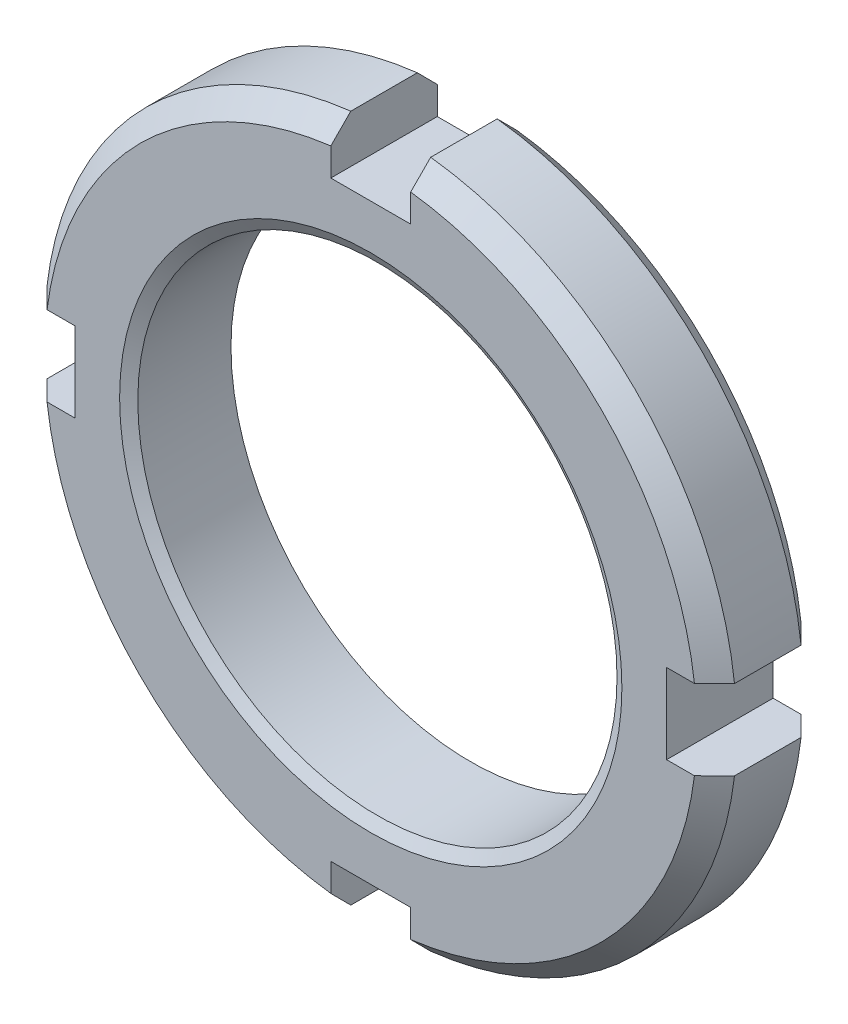
ISO-10303-21;
HEADER;
FILE_DESCRIPTION(('STEP AP214'),'2;1');
FILE_NAME('part.step','',(''),(''),'','','');
FILE_SCHEMA(('AUTOMOTIVE_DESIGN { 1 0 10303 214 1 1 1 1 }'));
ENDSEC;
DATA;
#1=APPLICATION_CONTEXT('core data for automotive mechanical design processes');
#2=APPLICATION_PROTOCOL_DEFINITION('international standard','automotive_design',2000,#1);
#3=PRODUCT_CONTEXT('',#1,'mechanical');
#4=PRODUCT('Part','Part','',(#3));
#5=PRODUCT_RELATED_PRODUCT_CATEGORY('part','',(#4));
#6=PRODUCT_DEFINITION_FORMATION('','',#4);
#7=PRODUCT_DEFINITION_CONTEXT('part definition',#1,'design');
#8=PRODUCT_DEFINITION('design','',#6,#7);
#9=PRODUCT_DEFINITION_SHAPE('','',#8);
#10=(LENGTH_UNIT() NAMED_UNIT(*) SI_UNIT(.MILLI.,.METRE.));
#11=(NAMED_UNIT(*) PLANE_ANGLE_UNIT() SI_UNIT($,.RADIAN.));
#12=(NAMED_UNIT(*) SI_UNIT($,.STERADIAN.) SOLID_ANGLE_UNIT());
#13=UNCERTAINTY_MEASURE_WITH_UNIT(LENGTH_MEASURE(1.E-05),#10,'distance_accuracy_value','');
#14=(GEOMETRIC_REPRESENTATION_CONTEXT(3) GLOBAL_UNCERTAINTY_ASSIGNED_CONTEXT((#13)) GLOBAL_UNIT_ASSIGNED_CONTEXT((#10,
#11,#12)) REPRESENTATION_CONTEXT('',''));
#15=CARTESIAN_POINT('',(0.,0.,0.));
#16=DIRECTION('',(0.,0.,1.));
#17=DIRECTION('',(1.,0.,0.));
#18=AXIS2_PLACEMENT_3D('',#15,#16,#17);
#19=CARTESIAN_POINT('',(0.,0.,8.));
#20=DIRECTION('',(0.,0.,-1.));
#21=DIRECTION('',(-1.,0.,0.));
#22=AXIS2_PLACEMENT_3D('',#19,#20,#21);
#23=CYLINDRICAL_SURFACE('',#22,26.);
#24=CARTESIAN_POINT('',(0.,0.,6.49999999999999));
#25=DIRECTION('',(0.,0.,1.));
#26=DIRECTION('',(1.,0.,0.));
#27=AXIS2_PLACEMENT_3D('',#24,#25,#26);
#28=CIRCLE('',#27,26.);
#29=CARTESIAN_POINT('',(3.00000000000018,25.8263431402899,6.49999999999999));
#30=VERTEX_POINT('',#29);
#31=CARTESIAN_POINT('',(25.8263431402899,2.99999999999973,6.49999999999999));
#32=VERTEX_POINT('',#31);
#33=EDGE_CURVE('E491',#30,#32,#28,.F.);
#34=ORIENTED_EDGE('',*,*,#33,.T.);
#35=DIRECTION('',(0.,0.,1.));
#36=VECTOR('',#35,1.);
#37=CARTESIAN_POINT('',(25.8263431402899,2.99999999999973,0.));
#38=LINE('',#37,#36);
#39=CARTESIAN_POINT('',(25.8263431402899,2.99999999999973,1.5));
#40=VERTEX_POINT('',#39);
#41=EDGE_CURVE('E233',#40,#32,#38,.T.);
#42=ORIENTED_EDGE('',*,*,#41,.F.);
#43=CARTESIAN_POINT('',(0.,0.,1.5));
#44=DIRECTION('',(0.,0.,1.));
#45=DIRECTION('',(1.,0.,0.));
#46=AXIS2_PLACEMENT_3D('',#43,#44,#45);
#47=CIRCLE('',#46,26.);
#48=CARTESIAN_POINT('',(3.00000000000018,25.8263431402899,1.5));
#49=VERTEX_POINT('',#48);
#50=EDGE_CURVE('E61',#40,#49,#47,.T.);
#51=ORIENTED_EDGE('',*,*,#50,.T.);
#52=DIRECTION('',(0.,0.,1.));
#53=VECTOR('',#52,1.);
#54=CARTESIAN_POINT('',(3.00000000000018,25.8263431402899,0.));
#55=LINE('',#54,#53);
#56=EDGE_CURVE('E560',#49,#30,#55,.T.);
#57=ORIENTED_EDGE('',*,*,#56,.T.);
#58=EDGE_LOOP('',(#34,#42,#51,#57));
#59=FACE_BOUND('',#58,.T.);
#60=ADVANCED_FACE('F38',(#59),#23,.T.);
#61=CARTESIAN_POINT('',(0.,0.,8.));
#62=DIRECTION('',(0.,0.,-1.));
#63=DIRECTION('',(-1.,0.,0.));
#64=AXIS2_PLACEMENT_3D('',#61,#62,#63);
#65=CONICAL_SURFACE('',#64,24.5,0.785398163397445);
#66=CARTESIAN_POINT('',(30.1313629364926,2.99999999999969,2.21965930821382));
#67=CARTESIAN_POINT('',(29.2073124987335,2.9999999999997,3.13914011143275));
#68=CARTESIAN_POINT('',(28.2830765827865,2.99999999999971,4.05843471087978));
#69=CARTESIAN_POINT('',(26.4340463341911,2.99999999999972,5.8964606902015));
#70=CARTESIAN_POINT('',(25.5092520019723,2.99999999999973,6.81519207050853));
#71=CARTESIAN_POINT('',(23.6589156087622,2.99999999999975,8.65190264222511));
#72=CARTESIAN_POINT('',(22.733373547422,2.99999999999976,9.56988183328331));
#73=CARTESIAN_POINT('',(21.3442551493303,2.99999999999978,10.9460384818329));
#74=CARTESIAN_POINT('',(20.8810812877656,2.99999999999978,11.4046221841258));
#75=CARTESIAN_POINT('',(19.9544022548731,2.99999999999979,12.3214548600768));
#76=CARTESIAN_POINT('',(19.4908970834902,2.9999999999998,12.779703833679));
#77=CARTESIAN_POINT('',(19.0271948382415,2.9999999999998,13.2377534173087));
#78=B_SPLINE_CURVE_WITH_KNOTS('',3,(#66,#67,#68,#69,#70,#71,#72,#73,#74,#75,#76,#77),
.UNSPECIFIED.,.F.,.F.,(4,2,2,2,2,4),(0.,3.91073251085395,7.8214620159967,11.7321933468449,
13.6875605126465,15.6429280046587),.UNSPECIFIED.);
#79=CARTESIAN_POINT('',(24.3156328315757,2.99999999999975,8.));
#80=VERTEX_POINT('',#79);
#81=EDGE_CURVE('E242',#32,#80,#78,.T.);
#82=ORIENTED_EDGE('',*,*,#81,.F.);
#83=ORIENTED_EDGE('',*,*,#33,.F.);
#84=CARTESIAN_POINT('',(3.00000000000013,19.0271948382414,13.2377534173087));
#85=CARTESIAN_POINT('',(3.00000000000013,19.4908970834901,12.779703833679));
#86=CARTESIAN_POINT('',(3.00000000000014,19.9544022548731,12.3214548600768));
#87=CARTESIAN_POINT('',(3.00000000000014,20.8810812877655,11.4046221841258));
#88=CARTESIAN_POINT('',(3.00000000000015,21.3442551493302,10.9460384818329));
#89=CARTESIAN_POINT('',(3.00000000000016,22.7333735474219,9.56988183328331));
#90=CARTESIAN_POINT('',(3.00000000000016,23.6589156087622,8.65190264222511));
#91=CARTESIAN_POINT('',(3.00000000000018,25.5092520019723,6.81519207050852));
#92=CARTESIAN_POINT('',(3.00000000000018,26.434046334191,5.8964606902015));
#93=CARTESIAN_POINT('',(3.00000000000019,28.2830765827864,4.05843471087978));
#94=CARTESIAN_POINT('',(3.0000000000002,29.2073124987334,3.13914011143275));
#95=CARTESIAN_POINT('',(3.00000000000021,30.1313629364926,2.21965930821382));
#96=B_SPLINE_CURVE_WITH_KNOTS('',3,(#84,#85,#86,#87,#88,#89,#90,#91,#92,#93,#94,#95),
.UNSPECIFIED.,.F.,.F.,(4,2,2,2,2,4),(0.,1.95536749201216,3.9107346578138,7.82146598866199,
11.7321954938047,15.6429280046587),.UNSPECIFIED.);
#97=CARTESIAN_POINT('',(3.00000000000017,24.3156328315756,8.));
#98=VERTEX_POINT('',#97);
#99=EDGE_CURVE('E334',#98,#30,#96,.T.);
#100=ORIENTED_EDGE('',*,*,#99,.F.);
#101=CARTESIAN_POINT('',(0.,0.,8.));
#102=DIRECTION('',(0.,0.,1.));
#103=DIRECTION('',(1.,0.,0.));
#104=AXIS2_PLACEMENT_3D('',#101,#102,#103);
#105=CIRCLE('',#104,24.5);
#106=EDGE_CURVE('E510',#80,#98,#105,.T.);
#107=ORIENTED_EDGE('',*,*,#106,.F.);
#108=EDGE_LOOP('',(#82,#83,#100,#107));
#109=FACE_BOUND('',#108,.T.);
#110=ADVANCED_FACE('F446',(#109),#65,.T.);
#111=CARTESIAN_POINT('',(0.,0.,1.5));
#112=DIRECTION('',(0.,0.,1.));
#113=DIRECTION('',(1.,0.,0.));
#114=AXIS2_PLACEMENT_3D('',#111,#112,#113);
#115=CONICAL_SURFACE('',#114,26.,0.785398163397449);
#116=CARTESIAN_POINT('',(19.0271948382415,2.9999999999998,-5.23775341730871));
#117=CARTESIAN_POINT('',(19.4908970834902,2.9999999999998,-4.77970383367899));
#118=CARTESIAN_POINT('',(19.9544022548731,2.99999999999979,-4.32145486007675));
#119=CARTESIAN_POINT('',(20.8810812877655,2.99999999999978,-3.40462218412577));
#120=CARTESIAN_POINT('',(21.3442551493303,2.99999999999978,-2.9460384818329));
#121=CARTESIAN_POINT('',(22.733373547422,2.99999999999976,-1.56988183328331));
#122=CARTESIAN_POINT('',(23.6589156087622,2.99999999999975,-0.651902642225105));
#123=CARTESIAN_POINT('',(25.5092520019723,2.99999999999973,1.18480792949147));
#124=CARTESIAN_POINT('',(26.4340463341911,2.99999999999972,2.10353930979849));
#125=CARTESIAN_POINT('',(28.2830765827865,2.99999999999971,3.9415652891202));
#126=CARTESIAN_POINT('',(29.2073124987335,2.9999999999997,4.86085988856722));
#127=CARTESIAN_POINT('',(30.1313629364926,2.99999999999969,5.78034069178615));
#128=B_SPLINE_CURVE_WITH_KNOTS('',3,(#116,#117,#118,#119,#120,#121,#122,#123,#124,#125,#126,
#127),.UNSPECIFIED.,.F.,.F.,(4,2,2,2,2,4),(0.,1.95536749201216,3.91073465781379,
7.82146598866199,11.7321954938047,15.6429280046587),.UNSPECIFIED.);
#129=CARTESIAN_POINT('',(24.3156328315757,2.99999999999975,0.));
#130=VERTEX_POINT('',#129);
#131=EDGE_CURVE('E266',#130,#40,#128,.T.);
#132=ORIENTED_EDGE('',*,*,#131,.F.);
#133=CARTESIAN_POINT('',(0.,0.,0.));
#134=DIRECTION('',(0.,0.,1.));
#135=DIRECTION('',(1.,0.,0.));
#136=AXIS2_PLACEMENT_3D('',#133,#134,#135);
#137=CIRCLE('',#136,24.5);
#138=CARTESIAN_POINT('',(3.00000000000017,24.3156328315756,0.));
#139=VERTEX_POINT('',#138);
#140=EDGE_CURVE('E415',#139,#130,#137,.F.);
#141=ORIENTED_EDGE('',*,*,#140,.F.);
#142=CARTESIAN_POINT('',(3.00000000000021,30.1313629364926,5.78034069178615));
#143=CARTESIAN_POINT('',(3.0000000000002,29.2073124987334,4.86085988856723));
#144=CARTESIAN_POINT('',(3.00000000000019,28.2830765827865,3.9415652891202));
#145=CARTESIAN_POINT('',(3.00000000000018,26.434046334191,2.10353930979849));
#146=CARTESIAN_POINT('',(3.00000000000018,25.5092520019723,1.18480792949147));
#147=CARTESIAN_POINT('',(3.00000000000016,23.6589156087622,-0.651902642225102));
#148=CARTESIAN_POINT('',(3.00000000000016,22.7333735474219,-1.5698818332833));
#149=CARTESIAN_POINT('',(3.00000000000015,21.3442551493302,-2.9460384818329));
#150=CARTESIAN_POINT('',(3.00000000000014,20.8810812877655,-3.40462218412577));
#151=CARTESIAN_POINT('',(3.00000000000014,19.9544022548731,-4.32145486007675));
#152=CARTESIAN_POINT('',(3.00000000000013,19.4908970834901,-4.77970383367899));
#153=CARTESIAN_POINT('',(3.00000000000013,19.0271948382414,-5.23775341730871));
#154=B_SPLINE_CURVE_WITH_KNOTS('',3,(#142,#143,#144,#145,#146,#147,#148,#149,#150,#151,#152,
#153),.UNSPECIFIED.,.F.,.F.,(4,2,2,2,2,4),(0.,3.91073251085395,7.82146201599669,
11.7321933468449,13.6875605126465,15.6429280046587),.UNSPECIFIED.);
#155=EDGE_CURVE('E319',#49,#139,#154,.T.);
#156=ORIENTED_EDGE('',*,*,#155,.F.);
#157=ORIENTED_EDGE('',*,*,#50,.F.);
#158=EDGE_LOOP('',(#132,#141,#156,#157));
#159=FACE_BOUND('',#158,.T.);
#160=ADVANCED_FACE('F281',(#159),#115,.T.);
#161=CARTESIAN_POINT('',(-25.8263431402899,3.00000000000009,6.49999999999999));
#162=VERTEX_POINT('',#161);
#163=CARTESIAN_POINT('',(-2.99999999999982,25.8263431402899,6.49999999999999));
#164=VERTEX_POINT('',#163);
#165=EDGE_CURVE('E488',#162,#164,#28,.F.);
#166=ORIENTED_EDGE('',*,*,#165,.T.);
#167=DIRECTION('',(0.,0.,1.));
#168=VECTOR('',#167,1.);
#169=CARTESIAN_POINT('',(-2.99999999999982,25.8263431402899,0.));
#170=LINE('',#169,#168);
#171=CARTESIAN_POINT('',(-2.99999999999982,25.8263431402899,1.5));
#172=VERTEX_POINT('',#171);
#173=EDGE_CURVE('E562',#172,#164,#170,.T.);
#174=ORIENTED_EDGE('',*,*,#173,.F.);
#175=CARTESIAN_POINT('',(-25.8263431402899,3.00000000000009,1.5));
#176=VERTEX_POINT('',#175);
#177=EDGE_CURVE('E499',#172,#176,#47,.T.);
#178=ORIENTED_EDGE('',*,*,#177,.T.);
#179=DIRECTION('',(0.,0.,1.));
#180=VECTOR('',#179,1.);
#181=CARTESIAN_POINT('',(-25.8263431402899,3.00000000000009,0.));
#182=LINE('',#181,#180);
#183=EDGE_CURVE('E372',#176,#162,#182,.T.);
#184=ORIENTED_EDGE('',*,*,#183,.T.);
#185=EDGE_LOOP('',(#166,#174,#178,#184));
#186=FACE_BOUND('',#185,.T.);
#187=ADVANCED_FACE('F447',(#186),#23,.T.);
#188=CARTESIAN_POINT('',(-2.99999999999979,30.1313629364926,2.21965930821382));
#189=CARTESIAN_POINT('',(-2.9999999999998,29.2073124987335,3.13914011143275));
#190=CARTESIAN_POINT('',(-2.9999999999998,28.2830765827865,4.05843471087978));
#191=CARTESIAN_POINT('',(-2.99999999999982,26.434046334191,5.8964606902015));
#192=CARTESIAN_POINT('',(-2.99999999999982,25.5092520019723,6.81519207050852));
#193=CARTESIAN_POINT('',(-2.99999999999984,23.6589156087622,8.65190264222511));
#194=CARTESIAN_POINT('',(-2.99999999999984,22.733373547422,9.56988183328331));
#195=CARTESIAN_POINT('',(-2.99999999999985,21.3442551493303,10.9460384818329));
#196=CARTESIAN_POINT('',(-2.99999999999986,20.8810812877655,11.4046221841258));
#197=CARTESIAN_POINT('',(-2.99999999999986,19.9544022548731,12.3214548600768));
#198=CARTESIAN_POINT('',(-2.99999999999987,19.4908970834902,12.779703833679));
#199=CARTESIAN_POINT('',(-2.99999999999987,19.0271948382415,13.2377534173087));
#200=B_SPLINE_CURVE_WITH_KNOTS('',3,(#188,#189,#190,#191,#192,#193,#194,#195,#196,#197,#198,
#199),.UNSPECIFIED.,.F.,.F.,(4,2,2,2,2,4),(0.,3.91073251085395,7.8214620159967,11.7321933468449,
13.6875605126465,15.6429280046587),.UNSPECIFIED.);
#201=CARTESIAN_POINT('',(-2.99999999999983,24.3156328315757,8.));
#202=VERTEX_POINT('',#201);
#203=EDGE_CURVE('E340',#164,#202,#200,.T.);
#204=ORIENTED_EDGE('',*,*,#203,.F.);
#205=ORIENTED_EDGE('',*,*,#165,.F.);
#206=CARTESIAN_POINT('',(-19.8573214043135,3.00000000000007,12.4173404810467));
#207=CARTESIAN_POINT('',(-20.7842447544094,3.00000000000007,11.5007548146203));
#208=CARTESIAN_POINT('',(-21.7105177050019,3.00000000000007,10.5835122115696));
#209=CARTESIAN_POINT('',(-23.5620767121408,3.00000000000008,8.74803253484022));
#210=CARTESIAN_POINT('',(-24.4873627693173,3.00000000000008,7.8297954617972));
#211=CARTESIAN_POINT('',(-26.3372627372447,3.00000000000009,5.99264541428472));
#212=CARTESIAN_POINT('',(-27.2618766482431,3.00000000000009,5.07373244006441));
#213=CARTESIAN_POINT('',(-29.1105936921881,3.0000000000001,3.23539164256677));
#214=CARTESIAN_POINT('',(-30.0346968248145,3.0000000000001,2.31596381896732));
#215=CARTESIAN_POINT('',(-30.9586245027919,3.0000000000001,1.39635984157373));
#216=B_SPLINE_CURVE_WITH_KNOTS('',3,(#206,#207,#208,#209,#210,#211,#212,#213,#214,#215),
.UNSPECIFIED.,.F.,.F.,(4,2,2,2,4),(0.,3.91073354108376,7.82146458395427,11.7321941859439,
15.6429262375267),.UNSPECIFIED.);
#217=CARTESIAN_POINT('',(-24.3156328315756,3.00000000000008,8.));
#218=VERTEX_POINT('',#217);
#219=EDGE_CURVE('E369',#218,#162,#216,.T.);
#220=ORIENTED_EDGE('',*,*,#219,.F.);
#221=EDGE_CURVE('E515',#202,#218,#105,.T.);
#222=ORIENTED_EDGE('',*,*,#221,.F.);
#223=EDGE_LOOP('',(#204,#205,#220,#222));
#224=FACE_BOUND('',#223,.T.);
#225=ADVANCED_FACE('F453',(#224),#65,.T.);
#226=CARTESIAN_POINT('',(-2.99999999999987,19.0271948382415,-5.23775341730871));
#227=CARTESIAN_POINT('',(-2.99999999999987,19.4908970834902,-4.77970383367899));
#228=CARTESIAN_POINT('',(-2.99999999999986,19.9544022548731,-4.32145486007675));
#229=CARTESIAN_POINT('',(-2.99999999999986,20.8810812877655,-3.40462218412577));
#230=CARTESIAN_POINT('',(-2.99999999999985,21.3442551493303,-2.9460384818329));
#231=CARTESIAN_POINT('',(-2.99999999999984,22.733373547422,-1.5698818332833));
#232=CARTESIAN_POINT('',(-2.99999999999984,23.6589156087622,-0.6519026422251));
#233=CARTESIAN_POINT('',(-2.99999999999982,25.5092520019723,1.18480792949148));
#234=CARTESIAN_POINT('',(-2.99999999999982,26.4340463341911,2.10353930979849));
#235=CARTESIAN_POINT('',(-2.9999999999998,28.2830765827865,3.9415652891202));
#236=CARTESIAN_POINT('',(-2.9999999999998,29.2073124987335,4.86085988856723));
#237=CARTESIAN_POINT('',(-2.99999999999979,30.1313629364926,5.78034069178615));
#238=B_SPLINE_CURVE_WITH_KNOTS('',3,(#226,#227,#228,#229,#230,#231,#232,#233,#234,#235,#236,
#237),.UNSPECIFIED.,.F.,.F.,(4,2,2,2,2,4),(0.,1.95536749201215,3.91073465781379,
7.82146598866199,11.7321954938047,15.6429280046587),.UNSPECIFIED.);
#239=CARTESIAN_POINT('',(-2.99999999999983,24.3156328315757,0.));
#240=VERTEX_POINT('',#239);
#241=EDGE_CURVE('E267',#240,#172,#238,.T.);
#242=ORIENTED_EDGE('',*,*,#241,.F.);
#243=CARTESIAN_POINT('',(-24.3156328315756,3.00000000000008,0.));
#244=VERTEX_POINT('',#243);
#245=EDGE_CURVE('E411',#244,#240,#137,.F.);
#246=ORIENTED_EDGE('',*,*,#245,.F.);
#247=CARTESIAN_POINT('',(-30.5840452030114,3.0000000000001,6.23082851111965));
#248=CARTESIAN_POINT('',(-29.660064270092,3.0000000000001,5.3112779535301));
#249=CARTESIAN_POINT('',(-28.735901833792,3.0000000000001,4.3919096373639));
#250=CARTESIAN_POINT('',(-26.8870453113016,3.00000000000009,2.55370903917691));
#251=CARTESIAN_POINT('',(-25.9623512254766,3.00000000000009,1.63487675678853));
#252=CARTESIAN_POINT('',(-24.1122611135231,3.00000000000008,-0.202081861988787));
#253=CARTESIAN_POINT('',(-23.1868650871071,3.00000000000008,-1.12020819808834));
#254=CARTESIAN_POINT('',(-21.3350354411678,3.00000000000007,-2.95541504899515));
#255=CARTESIAN_POINT('',(-20.4086018209177,3.00000000000007,-3.87249556306902));
#256=CARTESIAN_POINT('',(-19.4814820363252,3.00000000000007,-4.78888277312363));
#257=B_SPLINE_CURVE_WITH_KNOTS('',3,(#247,#248,#249,#250,#251,#252,#253,#254,#255,#256),
.UNSPECIFIED.,.F.,.F.,(4,2,2,2,4),(0.,3.91073224651511,7.82146180805566,11.7321929718676,
15.6429268764249),.UNSPECIFIED.);
#258=EDGE_CURVE('E305',#176,#244,#257,.T.);
#259=ORIENTED_EDGE('',*,*,#258,.F.);
#260=ORIENTED_EDGE('',*,*,#177,.F.);
#261=EDGE_LOOP('',(#242,#246,#259,#260));
#262=FACE_BOUND('',#261,.T.);
#263=ADVANCED_FACE('F470',(#262),#115,.T.);
#264=CARTESIAN_POINT('',(-3.,-25.8263431402899,6.49999999999999));
#265=VERTEX_POINT('',#264);
#266=CARTESIAN_POINT('',(-25.8263431402899,-2.99999999999991,6.49999999999999));
#267=VERTEX_POINT('',#266);
#268=EDGE_CURVE('E482',#265,#267,#28,.F.);
#269=ORIENTED_EDGE('',*,*,#268,.T.);
#270=DIRECTION('',(0.,0.,1.));
#271=VECTOR('',#270,1.);
#272=CARTESIAN_POINT('',(-25.8263431402899,-2.99999999999991,0.));
#273=LINE('',#272,#271);
#274=CARTESIAN_POINT('',(-25.8263431402899,-2.99999999999991,1.5));
#275=VERTEX_POINT('',#274);
#276=EDGE_CURVE('E370',#275,#267,#273,.T.);
#277=ORIENTED_EDGE('',*,*,#276,.F.);
#278=CARTESIAN_POINT('',(-3.,-25.8263431402899,1.5));
#279=VERTEX_POINT('',#278);
#280=EDGE_CURVE('E497',#275,#279,#47,.T.);
#281=ORIENTED_EDGE('',*,*,#280,.T.);
#282=DIRECTION('',(0.,0.,1.));
#283=VECTOR('',#282,1.);
#284=CARTESIAN_POINT('',(-3.,-25.8263431402899,0.));
#285=LINE('',#284,#283);
#286=EDGE_CURVE('E485',#279,#265,#285,.T.);
#287=ORIENTED_EDGE('',*,*,#286,.T.);
#288=EDGE_LOOP('',(#269,#277,#281,#287));
#289=FACE_BOUND('',#288,.T.);
#290=ADVANCED_FACE('F458',(#289),#23,.T.);
#291=CARTESIAN_POINT('',(-30.9586245027919,-2.99999999999989,1.39635984157373));
#292=CARTESIAN_POINT('',(-30.0346968248145,-2.9999999999999,2.31596381896732));
#293=CARTESIAN_POINT('',(-29.1105936921881,-2.9999999999999,3.23539164256678));
#294=CARTESIAN_POINT('',(-27.2618766482431,-2.99999999999991,5.07373244006441));
#295=CARTESIAN_POINT('',(-26.3372627372447,-2.99999999999991,5.99264541428472));
#296=CARTESIAN_POINT('',(-24.4873627693173,-2.99999999999992,7.82979546179721));
#297=CARTESIAN_POINT('',(-23.5620767121408,-2.99999999999992,8.74803253484023));
#298=CARTESIAN_POINT('',(-21.7105177050019,-2.99999999999993,10.5835122115696));
#299=CARTESIAN_POINT('',(-20.7842447544094,-2.99999999999993,11.5007548146203));
#300=CARTESIAN_POINT('',(-19.8573214043135,-2.99999999999993,12.4173404810467));
#301=B_SPLINE_CURVE_WITH_KNOTS('',3,(#291,#292,#293,#294,#295,#296,#297,#298,#299,#300),
.UNSPECIFIED.,.F.,.F.,(4,2,2,2,4),(0.,3.91073205158287,7.82146165357248,11.732192696443,
15.6429262375267),.UNSPECIFIED.);
#302=CARTESIAN_POINT('',(-24.3156328315757,-2.99999999999992,8.));
#303=VERTEX_POINT('',#302);
#304=EDGE_CURVE('E380',#267,#303,#301,.T.);
#305=ORIENTED_EDGE('',*,*,#304,.F.);
#306=ORIENTED_EDGE('',*,*,#268,.F.);
#307=CARTESIAN_POINT('',(-3.,-24.3156328315757,8.));
#308=CARTESIAN_POINT('',(-3.,-24.5674710923891,7.75005358911742));
#309=CARTESIAN_POINT('',(-3.,-24.8192827485643,7.50008038363407));
#310=CARTESIAN_POINT('',(-3.,-25.322852851469,7.00008038363402));
#311=CARTESIAN_POINT('',(-3.,-25.5746112981985,6.75005358911737));
#312=CARTESIAN_POINT('',(-3.,-25.8263431402899,6.49999999999999));
#313=B_SPLINE_CURVE_WITH_KNOTS('',3,(#307,#308,#309,#310,#311,#312),.UNSPECIFIED.,.F.,.F.,(4,2,
4),(0.,1.06445357945192,2.1289071581877),.UNSPECIFIED.);
#314=CARTESIAN_POINT('',(-3.,-24.3156328315757,8.));
#315=VERTEX_POINT('',#314);
#316=EDGE_CURVE('E500',#315,#265,#313,.T.);
#317=ORIENTED_EDGE('',*,*,#316,.F.);
#318=EDGE_CURVE('E511',#303,#315,#105,.T.);
#319=ORIENTED_EDGE('',*,*,#318,.F.);
#320=EDGE_LOOP('',(#305,#306,#317,#319));
#321=FACE_BOUND('',#320,.T.);
#322=ADVANCED_FACE('F469',(#321),#65,.T.);
#323=CARTESIAN_POINT('',(-19.4814820363252,-2.99999999999993,-4.78888277312363));
#324=CARTESIAN_POINT('',(-20.4086018209178,-2.99999999999993,-3.87249556306902));
#325=CARTESIAN_POINT('',(-21.3350354411678,-2.99999999999993,-2.95541504899515));
#326=CARTESIAN_POINT('',(-23.1868650871071,-2.99999999999992,-1.12020819808834));
#327=CARTESIAN_POINT('',(-24.1122611135231,-2.99999999999992,-0.202081861988786));
#328=CARTESIAN_POINT('',(-25.9623512254766,-2.99999999999991,1.63487675678853));
#329=CARTESIAN_POINT('',(-26.8870453113016,-2.99999999999991,2.55370903917691));
#330=CARTESIAN_POINT('',(-28.735901833792,-2.9999999999999,4.3919096373639));
#331=CARTESIAN_POINT('',(-29.660064270092,-2.9999999999999,5.3112779535301));
#332=CARTESIAN_POINT('',(-30.5840452030114,-2.99999999999989,6.23082851111965));
#333=B_SPLINE_CURVE_WITH_KNOTS('',3,(#323,#324,#325,#326,#327,#328,#329,#330,#331,#332),
.UNSPECIFIED.,.F.,.F.,(4,2,2,2,4),(0.,3.9107339045573,7.82146506836919,11.7321946299097,
15.6429268764249),.UNSPECIFIED.);
#334=CARTESIAN_POINT('',(-24.3156328315757,-2.99999999999992,0.));
#335=VERTEX_POINT('',#334);
#336=EDGE_CURVE('E313',#335,#275,#333,.T.);
#337=ORIENTED_EDGE('',*,*,#336,.F.);
#338=CARTESIAN_POINT('',(-3.,-24.3156328315757,0.));
#339=VERTEX_POINT('',#338);
#340=EDGE_CURVE('E409',#339,#335,#137,.F.);
#341=ORIENTED_EDGE('',*,*,#340,.F.);
#342=CARTESIAN_POINT('',(-3.,-25.8263431402899,1.5));
#343=CARTESIAN_POINT('',(-3.,-25.5746112981985,1.24994641088262));
#344=CARTESIAN_POINT('',(-3.,-25.322852851469,0.999919616365968));
#345=CARTESIAN_POINT('',(-3.,-24.8192827485643,0.499919616365931));
#346=CARTESIAN_POINT('',(-3.,-24.5674710923891,0.249946410882583));
#347=CARTESIAN_POINT('',(-3.,-24.3156328315757,0.));
#348=B_SPLINE_CURVE_WITH_KNOTS('',3,(#342,#343,#344,#345,#346,#347),.UNSPECIFIED.,.F.,.F.,(4,2,
4),(0.,1.06445357873578,2.1289071581877),.UNSPECIFIED.);
#349=EDGE_CURVE('E286',#279,#339,#348,.T.);
#350=ORIENTED_EDGE('',*,*,#349,.F.);
#351=ORIENTED_EDGE('',*,*,#280,.F.);
#352=EDGE_LOOP('',(#337,#341,#350,#351));
#353=FACE_BOUND('',#352,.T.);
#354=ADVANCED_FACE('F282',(#353),#115,.T.);
#355=CARTESIAN_POINT('',(0.,0.,8.));
#356=DIRECTION('',(0.,0.,1.));
#357=DIRECTION('',(1.,0.,0.));
#358=AXIS2_PLACEMENT_3D('',#355,#356,#357);
#359=PLANE('',#358);
#360=CARTESIAN_POINT('',(0.,0.,8.));
#361=DIRECTION('',(0.,0.,1.));
#362=DIRECTION('',(1.,0.,0.));
#363=AXIS2_PLACEMENT_3D('',#360,#361,#362);
#364=CIRCLE('',#363,18.866);
#365=CARTESIAN_POINT('',(18.866,0.,8.));
#366=VERTEX_POINT('',#365);
#367=EDGE_CURVE('E11',#366,#366,#364,.F.);
#368=ORIENTED_EDGE('',*,*,#367,.T.);
#369=EDGE_LOOP('',(#368));
#370=FACE_BOUND('',#369,.T.);
#371=DIRECTION('',(-1.,0.,0.));
#372=VECTOR('',#371,1.);
#373=CARTESIAN_POINT('',(22.22634314029,2.99999999999977,8.));
#374=LINE('',#373,#372);
#375=CARTESIAN_POINT('',(22.22634314029,2.99999999999977,8.));
#376=VERTEX_POINT('',#375);
#377=EDGE_CURVE('E222',#80,#376,#374,.T.);
#378=ORIENTED_EDGE('',*,*,#377,.F.);
#379=ORIENTED_EDGE('',*,*,#106,.T.);
#380=DIRECTION('',(0.,1.,0.));
#381=VECTOR('',#380,1.);
#382=CARTESIAN_POINT('',(3.00000000000015,22.2263431402899,8.));
#383=LINE('',#382,#381);
#384=CARTESIAN_POINT('',(3.00000000000015,22.2263431402899,8.));
#385=VERTEX_POINT('',#384);
#386=EDGE_CURVE('E561',#385,#98,#383,.T.);
#387=ORIENTED_EDGE('',*,*,#386,.F.);
#388=DIRECTION('',(1.,0.,0.));
#389=VECTOR('',#388,1.);
#390=CARTESIAN_POINT('',(3.00000000000015,22.2263431402899,8.));
#391=LINE('',#390,#389);
#392=CARTESIAN_POINT('',(-2.99999999999985,22.2263431402899,8.));
#393=VERTEX_POINT('',#392);
#394=EDGE_CURVE('E572',#393,#385,#391,.T.);
#395=ORIENTED_EDGE('',*,*,#394,.F.);
#396=DIRECTION('',(0.,-1.,0.));
#397=VECTOR('',#396,1.);
#398=CARTESIAN_POINT('',(-2.99999999999985,22.2263431402899,8.));
#399=LINE('',#398,#397);
#400=EDGE_CURVE('E568',#202,#393,#399,.T.);
#401=ORIENTED_EDGE('',*,*,#400,.F.);
#402=ORIENTED_EDGE('',*,*,#221,.T.);
#403=DIRECTION('',(-1.,0.,0.));
#404=VECTOR('',#403,1.);
#405=CARTESIAN_POINT('',(-22.2263431402899,3.00000000000008,8.));
#406=LINE('',#405,#404);
#407=CARTESIAN_POINT('',(-22.2263431402899,3.00000000000008,8.));
#408=VERTEX_POINT('',#407);
#409=EDGE_CURVE('E362',#408,#218,#406,.T.);
#410=ORIENTED_EDGE('',*,*,#409,.F.);
#411=DIRECTION('',(0.,1.,0.));
#412=VECTOR('',#411,1.);
#413=CARTESIAN_POINT('',(-22.2263431402899,3.00000000000008,8.));
#414=LINE('',#413,#412);
#415=CARTESIAN_POINT('',(-22.2263431402899,-2.99999999999992,8.));
#416=VERTEX_POINT('',#415);
#417=EDGE_CURVE('E348',#416,#408,#414,.T.);
#418=ORIENTED_EDGE('',*,*,#417,.F.);
#419=DIRECTION('',(1.,0.,0.));
#420=VECTOR('',#419,1.);
#421=CARTESIAN_POINT('',(-22.2263431402899,-2.99999999999992,8.));
#422=LINE('',#421,#420);
#423=EDGE_CURVE('E353',#303,#416,#422,.T.);
#424=ORIENTED_EDGE('',*,*,#423,.F.);
#425=ORIENTED_EDGE('',*,*,#318,.T.);
#426=DIRECTION('',(0.,-1.,0.));
#427=VECTOR('',#426,1.);
#428=CARTESIAN_POINT('',(-3.,-22.2263431402899,8.));
#429=LINE('',#428,#427);
#430=CARTESIAN_POINT('',(-3.,-22.2263431402899,8.));
#431=VERTEX_POINT('',#430);
#432=EDGE_CURVE('E543',#431,#315,#429,.T.);
#433=ORIENTED_EDGE('',*,*,#432,.F.);
#434=DIRECTION('',(-1.,0.,0.));
#435=VECTOR('',#434,1.);
#436=CARTESIAN_POINT('',(-3.,-22.2263431402899,8.));
#437=LINE('',#436,#435);
#438=CARTESIAN_POINT('',(3.,-22.2263431402899,8.));
#439=VERTEX_POINT('',#438);
#440=EDGE_CURVE('E542',#439,#431,#437,.T.);
#441=ORIENTED_EDGE('',*,*,#440,.F.);
#442=DIRECTION('',(0.,1.,0.));
#443=VECTOR('',#442,1.);
#444=CARTESIAN_POINT('',(3.,-22.2263431402899,8.));
#445=LINE('',#444,#443);
#446=CARTESIAN_POINT('',(3.,-24.3156328315757,8.));
#447=VERTEX_POINT('',#446);
#448=EDGE_CURVE('E531',#447,#439,#445,.T.);
#449=ORIENTED_EDGE('',*,*,#448,.F.);
#450=CARTESIAN_POINT('',(24.3156328315756,-3.00000000000025,8.));
#451=VERTEX_POINT('',#450);
#452=EDGE_CURVE('E504',#447,#451,#105,.T.);
#453=ORIENTED_EDGE('',*,*,#452,.T.);
#454=DIRECTION('',(1.,0.,0.));
#455=VECTOR('',#454,1.);
#456=CARTESIAN_POINT('',(22.2263431402899,-3.00000000000023,8.));
#457=LINE('',#456,#455);
#458=CARTESIAN_POINT('',(22.2263431402899,-3.00000000000023,8.));
#459=VERTEX_POINT('',#458);
#460=EDGE_CURVE('E224',#459,#451,#457,.T.);
#461=ORIENTED_EDGE('',*,*,#460,.F.);
#462=DIRECTION('',(0.,-1.,0.));
#463=VECTOR('',#462,1.);
#464=CARTESIAN_POINT('',(22.2263431402899,-3.00000000000023,8.));
#465=LINE('',#464,#463);
#466=EDGE_CURVE('E209',#376,#459,#465,.T.);
#467=ORIENTED_EDGE('',*,*,#466,.F.);
#468=EDGE_LOOP('',(#378,#379,#387,#395,#401,#402,#410,#418,#424,#425,#433,#441,#449,#453,#461,#467));
#469=FACE_BOUND('',#468,.T.);
#470=ADVANCED_FACE('F466',(#370,#469),#359,.T.);
#471=CARTESIAN_POINT('',(0.,0.,0.));
#472=DIRECTION('',(0.,0.,1.));
#473=DIRECTION('',(1.,0.,0.));
#474=AXIS2_PLACEMENT_3D('',#471,#472,#473);
#475=PLANE('',#474);
#476=CARTESIAN_POINT('',(0.,0.,0.));
#477=DIRECTION('',(0.,0.,1.));
#478=DIRECTION('',(1.,0.,0.));
#479=AXIS2_PLACEMENT_3D('',#476,#477,#478);
#480=CIRCLE('',#479,18.866);
#481=CARTESIAN_POINT('',(18.866,0.,0.));
#482=VERTEX_POINT('',#481);
#483=EDGE_CURVE('E426',#482,#482,#480,.T.);
#484=ORIENTED_EDGE('',*,*,#483,.T.);
#485=EDGE_LOOP('',(#484));
#486=FACE_BOUND('',#485,.T.);
#487=ORIENTED_EDGE('',*,*,#140,.T.);
#488=DIRECTION('',(-1.,0.,0.));
#489=VECTOR('',#488,1.);
#490=CARTESIAN_POINT('',(22.22634314029,2.99999999999977,0.));
#491=LINE('',#490,#489);
#492=CARTESIAN_POINT('',(22.22634314029,2.99999999999977,0.));
#493=VERTEX_POINT('',#492);
#494=EDGE_CURVE('E211',#130,#493,#491,.T.);
#495=ORIENTED_EDGE('',*,*,#494,.T.);
#496=DIRECTION('',(0.,-1.,0.));
#497=VECTOR('',#496,1.);
#498=CARTESIAN_POINT('',(22.2263431402899,-3.00000000000023,0.));
#499=LINE('',#498,#497);
#500=CARTESIAN_POINT('',(22.2263431402899,-3.00000000000023,0.));
#501=VERTEX_POINT('',#500);
#502=EDGE_CURVE('E206',#493,#501,#499,.T.);
#503=ORIENTED_EDGE('',*,*,#502,.T.);
#504=DIRECTION('',(1.,0.,0.));
#505=VECTOR('',#504,1.);
#506=CARTESIAN_POINT('',(22.2263431402899,-3.00000000000023,0.));
#507=LINE('',#506,#505);
#508=CARTESIAN_POINT('',(24.3156328315756,-3.00000000000025,0.));
#509=VERTEX_POINT('',#508);
#510=EDGE_CURVE('E214',#501,#509,#507,.T.);
#511=ORIENTED_EDGE('',*,*,#510,.T.);
#512=CARTESIAN_POINT('',(3.,-24.3156328315757,0.));
#513=VERTEX_POINT('',#512);
#514=EDGE_CURVE('E408',#509,#513,#137,.F.);
#515=ORIENTED_EDGE('',*,*,#514,.T.);
#516=DIRECTION('',(0.,1.,0.));
#517=VECTOR('',#516,1.);
#518=CARTESIAN_POINT('',(3.,-22.2263431402899,0.));
#519=LINE('',#518,#517);
#520=CARTESIAN_POINT('',(3.,-22.2263431402899,0.));
#521=VERTEX_POINT('',#520);
#522=EDGE_CURVE('E535',#513,#521,#519,.T.);
#523=ORIENTED_EDGE('',*,*,#522,.T.);
#524=DIRECTION('',(-1.,0.,0.));
#525=VECTOR('',#524,1.);
#526=CARTESIAN_POINT('',(-3.,-22.2263431402899,0.));
#527=LINE('',#526,#525);
#528=CARTESIAN_POINT('',(-3.,-22.2263431402899,0.));
#529=VERTEX_POINT('',#528);
#530=EDGE_CURVE('E539',#521,#529,#527,.T.);
#531=ORIENTED_EDGE('',*,*,#530,.T.);
#532=DIRECTION('',(0.,-1.,0.));
#533=VECTOR('',#532,1.);
#534=CARTESIAN_POINT('',(-3.,-22.2263431402899,0.));
#535=LINE('',#534,#533);
#536=EDGE_CURVE('E536',#529,#339,#535,.T.);
#537=ORIENTED_EDGE('',*,*,#536,.T.);
#538=ORIENTED_EDGE('',*,*,#340,.T.);
#539=DIRECTION('',(1.,0.,0.));
#540=VECTOR('',#539,1.);
#541=CARTESIAN_POINT('',(-22.2263431402899,-2.99999999999992,0.));
#542=LINE('',#541,#540);
#543=CARTESIAN_POINT('',(-22.2263431402899,-2.99999999999992,0.));
#544=VERTEX_POINT('',#543);
#545=EDGE_CURVE('E356',#335,#544,#542,.T.);
#546=ORIENTED_EDGE('',*,*,#545,.T.);
#547=DIRECTION('',(0.,1.,0.));
#548=VECTOR('',#547,1.);
#549=CARTESIAN_POINT('',(-22.2263431402899,3.00000000000008,0.));
#550=LINE('',#549,#548);
#551=CARTESIAN_POINT('',(-22.2263431402899,3.00000000000008,0.));
#552=VERTEX_POINT('',#551);
#553=EDGE_CURVE('E349',#544,#552,#550,.T.);
#554=ORIENTED_EDGE('',*,*,#553,.T.);
#555=DIRECTION('',(-1.,0.,0.));
#556=VECTOR('',#555,1.);
#557=CARTESIAN_POINT('',(-22.2263431402899,3.00000000000008,0.));
#558=LINE('',#557,#556);
#559=EDGE_CURVE('E352',#552,#244,#558,.T.);
#560=ORIENTED_EDGE('',*,*,#559,.T.);
#561=ORIENTED_EDGE('',*,*,#245,.T.);
#562=DIRECTION('',(0.,-1.,0.));
#563=VECTOR('',#562,1.);
#564=CARTESIAN_POINT('',(-2.99999999999985,22.2263431402899,0.));
#565=LINE('',#564,#563);
#566=CARTESIAN_POINT('',(-2.99999999999985,22.2263431402899,0.));
#567=VERTEX_POINT('',#566);
#568=EDGE_CURVE('E564',#240,#567,#565,.T.);
#569=ORIENTED_EDGE('',*,*,#568,.T.);
#570=DIRECTION('',(1.,0.,0.));
#571=VECTOR('',#570,1.);
#572=CARTESIAN_POINT('',(3.00000000000015,22.2263431402899,0.));
#573=LINE('',#572,#571);
#574=CARTESIAN_POINT('',(3.00000000000015,22.2263431402899,0.));
#575=VERTEX_POINT('',#574);
#576=EDGE_CURVE('E570',#567,#575,#573,.T.);
#577=ORIENTED_EDGE('',*,*,#576,.T.);
#578=DIRECTION('',(0.,1.,0.));
#579=VECTOR('',#578,1.);
#580=CARTESIAN_POINT('',(3.00000000000015,22.2263431402899,0.));
#581=LINE('',#580,#579);
#582=EDGE_CURVE('E421',#575,#139,#581,.T.);
#583=ORIENTED_EDGE('',*,*,#582,.T.);
#584=EDGE_LOOP('',(#487,#495,#503,#511,#515,#523,#531,#537,#538,#546,#554,#560,#561,#569,#577,#583));
#585=FACE_BOUND('',#584,.T.);
#586=ADVANCED_FACE('F221',(#486,#585),#475,.F.);
#587=CARTESIAN_POINT('',(3.,-25.8263431402899,1.5));
#588=VERTEX_POINT('',#587);
#589=CARTESIAN_POINT('',(25.8263431402899,-3.00000000000027,1.5));
#590=VERTEX_POINT('',#589);
#591=EDGE_CURVE('E493',#588,#590,#47,.T.);
#592=ORIENTED_EDGE('',*,*,#591,.T.);
#593=DIRECTION('',(0.,0.,1.));
#594=VECTOR('',#593,1.);
#595=CARTESIAN_POINT('',(25.8263431402899,-3.00000000000027,0.));
#596=LINE('',#595,#594);
#597=CARTESIAN_POINT('',(25.8263431402899,-3.00000000000027,6.49999999999999));
#598=VERTEX_POINT('',#597);
#599=EDGE_CURVE('E53',#590,#598,#596,.T.);
#600=ORIENTED_EDGE('',*,*,#599,.T.);
#601=CARTESIAN_POINT('',(3.,-25.8263431402899,6.49999999999999));
#602=VERTEX_POINT('',#601);
#603=EDGE_CURVE('E489',#598,#602,#28,.F.);
#604=ORIENTED_EDGE('',*,*,#603,.T.);
#605=DIRECTION('',(0.,0.,1.));
#606=VECTOR('',#605,1.);
#607=CARTESIAN_POINT('',(3.,-25.8263431402899,0.));
#608=LINE('',#607,#606);
#609=EDGE_CURVE('E522',#588,#602,#608,.T.);
#610=ORIENTED_EDGE('',*,*,#609,.F.);
#611=EDGE_LOOP('',(#592,#600,#604,#610));
#612=FACE_BOUND('',#611,.T.);
#613=ADVANCED_FACE('F448',(#612),#23,.T.);
#614=CARTESIAN_POINT('',(0.,0.,8.));
#615=DIRECTION('',(0.,0.,-1.));
#616=DIRECTION('',(-1.,0.,0.));
#617=AXIS2_PLACEMENT_3D('',#614,#615,#616);
#618=CYLINDRICAL_SURFACE('',#617,18.);
#619=CARTESIAN_POINT('',(0.,0.,0.5));
#620=DIRECTION('',(0.,0.,1.));
#621=DIRECTION('',(1.,0.,0.));
#622=AXIS2_PLACEMENT_3D('',#619,#620,#621);
#623=CIRCLE('',#622,18.);
#624=CARTESIAN_POINT('',(18.,0.,0.5));
#625=VERTEX_POINT('',#624);
#626=EDGE_CURVE('E46',#625,#625,#623,.F.);
#627=ORIENTED_EDGE('',*,*,#626,.T.);
#628=EDGE_LOOP('',(#627));
#629=FACE_BOUND('',#628,.T.);
#630=CARTESIAN_POINT('',(0.,0.,7.5));
#631=DIRECTION('',(0.,0.,1.));
#632=DIRECTION('',(1.,0.,0.));
#633=AXIS2_PLACEMENT_3D('',#630,#631,#632);
#634=CIRCLE('',#633,18.);
#635=CARTESIAN_POINT('',(18.,0.,7.5));
#636=VERTEX_POINT('',#635);
#637=EDGE_CURVE('E428',#636,#636,#634,.T.);
#638=ORIENTED_EDGE('',*,*,#637,.T.);
#639=EDGE_LOOP('',(#638));
#640=FACE_BOUND('',#639,.T.);
#641=ADVANCED_FACE('F436',(#629,#640),#618,.F.);
#642=CARTESIAN_POINT('',(-3.,-22.2263431402899,0.));
#643=DIRECTION('',(0.,1.,0.));
#644=DIRECTION('',(0.,0.,1.));
#645=AXIS2_PLACEMENT_3D('',#642,#643,#644);
#646=PLANE('',#645);
#647=ORIENTED_EDGE('',*,*,#440,.T.);
#648=DIRECTION('',(0.,0.,1.));
#649=VECTOR('',#648,1.);
#650=CARTESIAN_POINT('',(-3.,-22.2263431402899,0.));
#651=LINE('',#650,#649);
#652=EDGE_CURVE('E534',#529,#431,#651,.T.);
#653=ORIENTED_EDGE('',*,*,#652,.F.);
#654=ORIENTED_EDGE('',*,*,#530,.F.);
#655=DIRECTION('',(0.,0.,1.));
#656=VECTOR('',#655,1.);
#657=CARTESIAN_POINT('',(3.,-22.2263431402899,0.));
#658=LINE('',#657,#656);
#659=EDGE_CURVE('E517',#521,#439,#658,.T.);
#660=ORIENTED_EDGE('',*,*,#659,.T.);
#661=EDGE_LOOP('',(#647,#653,#654,#660));
#662=FACE_BOUND('',#661,.T.);
#663=ADVANCED_FACE('F399',(#662),#646,.F.);
#664=CARTESIAN_POINT('',(3.,-22.2263431402899,0.));
#665=DIRECTION('',(1.,0.,0.));
#666=DIRECTION('',(0.,1.,0.));
#667=AXIS2_PLACEMENT_3D('',#664,#665,#666);
#668=PLANE('',#667);
#669=ORIENTED_EDGE('',*,*,#609,.T.);
#670=CARTESIAN_POINT('',(3.,-25.8263431402899,6.49999999999999));
#671=CARTESIAN_POINT('',(3.,-25.5746112981985,6.75005358911737));
#672=CARTESIAN_POINT('',(3.,-25.322852851469,7.00008038363403));
#673=CARTESIAN_POINT('',(3.,-24.8192827485643,7.50008038363407));
#674=CARTESIAN_POINT('',(3.,-24.5674710923891,7.75005358911742));
#675=CARTESIAN_POINT('',(3.,-24.3156328315757,8.));
#676=B_SPLINE_CURVE_WITH_KNOTS('',3,(#670,#671,#672,#673,#674,#675),.UNSPECIFIED.,.F.,.F.,(4,2,
4),(0.,1.06445357873578,2.1289071581877),.UNSPECIFIED.);
#677=EDGE_CURVE('E404',#602,#447,#676,.T.);
#678=ORIENTED_EDGE('',*,*,#677,.T.);
#679=ORIENTED_EDGE('',*,*,#448,.T.);
#680=ORIENTED_EDGE('',*,*,#659,.F.);
#681=ORIENTED_EDGE('',*,*,#522,.F.);
#682=CARTESIAN_POINT('',(3.,-24.3156328315757,0.));
#683=CARTESIAN_POINT('',(3.,-24.5674710923891,0.249946410882582));
#684=CARTESIAN_POINT('',(3.,-24.8192827485643,0.49991961636593));
#685=CARTESIAN_POINT('',(3.,-25.322852851469,0.999919616365969));
#686=CARTESIAN_POINT('',(3.,-25.5746112981985,1.24994641088262));
#687=CARTESIAN_POINT('',(3.,-25.8263431402899,1.50000000000001));
#688=B_SPLINE_CURVE_WITH_KNOTS('',3,(#682,#683,#684,#685,#686,#687),.UNSPECIFIED.,.F.,.F.,(4,2,
4),(0.,1.06445357945192,2.1289071581877),.UNSPECIFIED.);
#689=EDGE_CURVE('E296',#513,#588,#688,.T.);
#690=ORIENTED_EDGE('',*,*,#689,.T.);
#691=EDGE_LOOP('',(#669,#678,#679,#680,#681,#690));
#692=FACE_BOUND('',#691,.T.);
#693=ADVANCED_FACE('F395',(#692),#668,.F.);
#694=CARTESIAN_POINT('',(-3.,-22.2263431402899,0.));
#695=DIRECTION('',(-1.,0.,0.));
#696=DIRECTION('',(0.,-1.,0.));
#697=AXIS2_PLACEMENT_3D('',#694,#695,#696);
#698=PLANE('',#697);
#699=ORIENTED_EDGE('',*,*,#432,.T.);
#700=ORIENTED_EDGE('',*,*,#316,.T.);
#701=ORIENTED_EDGE('',*,*,#286,.F.);
#702=ORIENTED_EDGE('',*,*,#349,.T.);
#703=ORIENTED_EDGE('',*,*,#536,.F.);
#704=ORIENTED_EDGE('',*,*,#652,.T.);
#705=EDGE_LOOP('',(#699,#700,#701,#702,#703,#704));
#706=FACE_BOUND('',#705,.T.);
#707=ADVANCED_FACE('F398',(#706),#698,.F.);
#708=CARTESIAN_POINT('',(19.0271948382414,-3.0000000000002,13.2377534173087));
#709=CARTESIAN_POINT('',(19.4908970834901,-3.0000000000002,12.779703833679));
#710=CARTESIAN_POINT('',(19.9544022548731,-3.00000000000021,12.3214548600768));
#711=CARTESIAN_POINT('',(20.8810812877655,-3.00000000000022,11.4046221841258));
#712=CARTESIAN_POINT('',(21.3442551493302,-3.00000000000022,10.9460384818329));
#713=CARTESIAN_POINT('',(22.7333735474219,-3.00000000000024,9.56988183328331));
#714=CARTESIAN_POINT('',(23.6589156087622,-3.00000000000025,8.65190264222511));
#715=CARTESIAN_POINT('',(25.5092520019723,-3.00000000000026,6.81519207050852));
#716=CARTESIAN_POINT('',(26.434046334191,-3.00000000000027,5.8964606902015));
#717=CARTESIAN_POINT('',(28.2830765827864,-3.00000000000029,4.05843471087978));
#718=CARTESIAN_POINT('',(29.2073124987334,-3.0000000000003,3.13914011143275));
#719=CARTESIAN_POINT('',(30.1313629364926,-3.00000000000031,2.21965930821382));
#720=B_SPLINE_CURVE_WITH_KNOTS('',3,(#708,#709,#710,#711,#712,#713,#714,#715,#716,#717,#718,
#719),.UNSPECIFIED.,.F.,.F.,(4,2,2,2,2,4),(0.,1.95536749201216,3.9107346578138,7.82146598866199,
11.7321954938047,15.6429280046587),.UNSPECIFIED.);
#721=EDGE_CURVE('E232',#451,#598,#720,.T.);
#722=ORIENTED_EDGE('',*,*,#721,.F.);
#723=ORIENTED_EDGE('',*,*,#452,.F.);
#724=ORIENTED_EDGE('',*,*,#677,.F.);
#725=ORIENTED_EDGE('',*,*,#603,.F.);
#726=EDGE_LOOP('',(#722,#723,#724,#725));
#727=FACE_BOUND('',#726,.T.);
#728=ADVANCED_FACE('F248',(#727),#65,.T.);
#729=CARTESIAN_POINT('',(30.1313629364926,-3.00000000000031,5.78034069178615));
#730=CARTESIAN_POINT('',(29.2073124987334,-3.0000000000003,4.86085988856723));
#731=CARTESIAN_POINT('',(28.2830765827864,-3.00000000000029,3.9415652891202));
#732=CARTESIAN_POINT('',(26.434046334191,-3.00000000000027,2.10353930979849));
#733=CARTESIAN_POINT('',(25.5092520019723,-3.00000000000026,1.18480792949147));
#734=CARTESIAN_POINT('',(23.6589156087622,-3.00000000000025,-0.651902642225105));
#735=CARTESIAN_POINT('',(22.7333735474219,-3.00000000000024,-1.56988183328331));
#736=CARTESIAN_POINT('',(21.3442551493302,-3.00000000000022,-2.9460384818329));
#737=CARTESIAN_POINT('',(20.8810812877655,-3.00000000000022,-3.40462218412577));
#738=CARTESIAN_POINT('',(19.954402254873,-3.00000000000021,-4.32145486007675));
#739=CARTESIAN_POINT('',(19.4908970834901,-3.0000000000002,-4.77970383367899));
#740=CARTESIAN_POINT('',(19.0271948382414,-3.0000000000002,-5.23775341730871));
#741=B_SPLINE_CURVE_WITH_KNOTS('',3,(#729,#730,#731,#732,#733,#734,#735,#736,#737,#738,#739,
#740),.UNSPECIFIED.,.F.,.F.,(4,2,2,2,2,4),(0.,3.91073251085395,7.82146201599669,
11.7321933468449,13.6875605126465,15.6429280046587),.UNSPECIFIED.);
#742=EDGE_CURVE('E216',#590,#509,#741,.T.);
#743=ORIENTED_EDGE('',*,*,#742,.F.);
#744=ORIENTED_EDGE('',*,*,#591,.F.);
#745=ORIENTED_EDGE('',*,*,#689,.F.);
#746=ORIENTED_EDGE('',*,*,#514,.F.);
#747=EDGE_LOOP('',(#743,#744,#745,#746));
#748=FACE_BOUND('',#747,.T.);
#749=ADVANCED_FACE('F276',(#748),#115,.T.);
#750=CARTESIAN_POINT('',(-22.2263431402899,3.00000000000008,0.));
#751=DIRECTION('',(1.,0.,0.));
#752=DIRECTION('',(0.,1.,0.));
#753=AXIS2_PLACEMENT_3D('',#750,#751,#752);
#754=PLANE('',#753);
#755=ORIENTED_EDGE('',*,*,#417,.T.);
#756=DIRECTION('',(0.,0.,1.));
#757=VECTOR('',#756,1.);
#758=CARTESIAN_POINT('',(-22.2263431402899,3.00000000000008,0.));
#759=LINE('',#758,#757);
#760=EDGE_CURVE('E359',#552,#408,#759,.T.);
#761=ORIENTED_EDGE('',*,*,#760,.F.);
#762=ORIENTED_EDGE('',*,*,#553,.F.);
#763=DIRECTION('',(0.,0.,1.));
#764=VECTOR('',#763,1.);
#765=CARTESIAN_POINT('',(-22.2263431402899,-2.99999999999992,0.));
#766=LINE('',#765,#764);
#767=EDGE_CURVE('E366',#544,#416,#766,.T.);
#768=ORIENTED_EDGE('',*,*,#767,.T.);
#769=EDGE_LOOP('',(#755,#761,#762,#768));
#770=FACE_BOUND('',#769,.T.);
#771=ADVANCED_FACE('F279',(#770),#754,.F.);
#772=CARTESIAN_POINT('',(-22.2263431402899,-2.99999999999992,0.));
#773=DIRECTION('',(0.,-1.,0.));
#774=DIRECTION('',(1.,0.,0.));
#775=AXIS2_PLACEMENT_3D('',#772,#773,#774);
#776=PLANE('',#775);
#777=ORIENTED_EDGE('',*,*,#304,.T.);
#778=ORIENTED_EDGE('',*,*,#423,.T.);
#779=ORIENTED_EDGE('',*,*,#767,.F.);
#780=ORIENTED_EDGE('',*,*,#545,.F.);
#781=ORIENTED_EDGE('',*,*,#336,.T.);
#782=ORIENTED_EDGE('',*,*,#276,.T.);
#783=EDGE_LOOP('',(#777,#778,#779,#780,#781,#782));
#784=FACE_BOUND('',#783,.T.);
#785=ADVANCED_FACE('F389',(#784),#776,.F.);
#786=CARTESIAN_POINT('',(-22.2263431402899,3.00000000000008,0.));
#787=DIRECTION('',(0.,1.,0.));
#788=DIRECTION('',(-1.,0.,0.));
#789=AXIS2_PLACEMENT_3D('',#786,#787,#788);
#790=PLANE('',#789);
#791=ORIENTED_EDGE('',*,*,#219,.T.);
#792=ORIENTED_EDGE('',*,*,#183,.F.);
#793=ORIENTED_EDGE('',*,*,#258,.T.);
#794=ORIENTED_EDGE('',*,*,#559,.F.);
#795=ORIENTED_EDGE('',*,*,#760,.T.);
#796=ORIENTED_EDGE('',*,*,#409,.T.);
#797=EDGE_LOOP('',(#791,#792,#793,#794,#795,#796));
#798=FACE_BOUND('',#797,.T.);
#799=ADVANCED_FACE('F385',(#798),#790,.F.);
#800=CARTESIAN_POINT('',(3.00000000000015,22.2263431402899,0.));
#801=DIRECTION('',(0.,-1.,0.));
#802=DIRECTION('',(1.,0.,0.));
#803=AXIS2_PLACEMENT_3D('',#800,#801,#802);
#804=PLANE('',#803);
#805=ORIENTED_EDGE('',*,*,#394,.T.);
#806=DIRECTION('',(0.,0.,1.));
#807=VECTOR('',#806,1.);
#808=CARTESIAN_POINT('',(3.00000000000015,22.2263431402899,0.));
#809=LINE('',#808,#807);
#810=EDGE_CURVE('E342',#575,#385,#809,.T.);
#811=ORIENTED_EDGE('',*,*,#810,.F.);
#812=ORIENTED_EDGE('',*,*,#576,.F.);
#813=DIRECTION('',(0.,0.,1.));
#814=VECTOR('',#813,1.);
#815=CARTESIAN_POINT('',(-2.99999999999985,22.2263431402899,0.));
#816=LINE('',#815,#814);
#817=EDGE_CURVE('E341',#567,#393,#816,.T.);
#818=ORIENTED_EDGE('',*,*,#817,.T.);
#819=EDGE_LOOP('',(#805,#811,#812,#818));
#820=FACE_BOUND('',#819,.T.);
#821=ADVANCED_FACE('F331',(#820),#804,.F.);
#822=CARTESIAN_POINT('',(-2.99999999999985,22.2263431402899,0.));
#823=DIRECTION('',(-1.,0.,0.));
#824=DIRECTION('',(0.,-1.,0.));
#825=AXIS2_PLACEMENT_3D('',#822,#823,#824);
#826=PLANE('',#825);
#827=ORIENTED_EDGE('',*,*,#203,.T.);
#828=ORIENTED_EDGE('',*,*,#400,.T.);
#829=ORIENTED_EDGE('',*,*,#817,.F.);
#830=ORIENTED_EDGE('',*,*,#568,.F.);
#831=ORIENTED_EDGE('',*,*,#241,.T.);
#832=ORIENTED_EDGE('',*,*,#173,.T.);
#833=EDGE_LOOP('',(#827,#828,#829,#830,#831,#832));
#834=FACE_BOUND('',#833,.T.);
#835=ADVANCED_FACE('F328',(#834),#826,.F.);
#836=CARTESIAN_POINT('',(3.00000000000015,22.2263431402899,0.));
#837=DIRECTION('',(1.,0.,0.));
#838=DIRECTION('',(0.,1.,0.));
#839=AXIS2_PLACEMENT_3D('',#836,#837,#838);
#840=PLANE('',#839);
#841=ORIENTED_EDGE('',*,*,#99,.T.);
#842=ORIENTED_EDGE('',*,*,#56,.F.);
#843=ORIENTED_EDGE('',*,*,#155,.T.);
#844=ORIENTED_EDGE('',*,*,#582,.F.);
#845=ORIENTED_EDGE('',*,*,#810,.T.);
#846=ORIENTED_EDGE('',*,*,#386,.T.);
#847=EDGE_LOOP('',(#841,#842,#843,#844,#845,#846));
#848=FACE_BOUND('',#847,.T.);
#849=ADVANCED_FACE('F324',(#848),#840,.F.);
#850=CARTESIAN_POINT('',(22.2263431402899,-3.00000000000023,0.));
#851=DIRECTION('',(-1.,0.,0.));
#852=DIRECTION('',(0.,-1.,0.));
#853=AXIS2_PLACEMENT_3D('',#850,#851,#852);
#854=PLANE('',#853);
#855=ORIENTED_EDGE('',*,*,#466,.T.);
#856=DIRECTION('',(0.,0.,1.));
#857=VECTOR('',#856,1.);
#858=CARTESIAN_POINT('',(22.2263431402899,-3.00000000000023,0.));
#859=LINE('',#858,#857);
#860=EDGE_CURVE('E201',#501,#459,#859,.T.);
#861=ORIENTED_EDGE('',*,*,#860,.F.);
#862=ORIENTED_EDGE('',*,*,#502,.F.);
#863=DIRECTION('',(0.,0.,1.));
#864=VECTOR('',#863,1.);
#865=CARTESIAN_POINT('',(22.22634314029,2.99999999999977,0.));
#866=LINE('',#865,#864);
#867=EDGE_CURVE('E230',#493,#376,#866,.T.);
#868=ORIENTED_EDGE('',*,*,#867,.T.);
#869=EDGE_LOOP('',(#855,#861,#862,#868));
#870=FACE_BOUND('',#869,.T.);
#871=ADVANCED_FACE('F203',(#870),#854,.F.);
#872=CARTESIAN_POINT('',(22.22634314029,2.99999999999977,0.));
#873=DIRECTION('',(0.,1.,0.));
#874=DIRECTION('',(-1.,0.,0.));
#875=AXIS2_PLACEMENT_3D('',#872,#873,#874);
#876=PLANE('',#875);
#877=ORIENTED_EDGE('',*,*,#81,.T.);
#878=ORIENTED_EDGE('',*,*,#377,.T.);
#879=ORIENTED_EDGE('',*,*,#867,.F.);
#880=ORIENTED_EDGE('',*,*,#494,.F.);
#881=ORIENTED_EDGE('',*,*,#131,.T.);
#882=ORIENTED_EDGE('',*,*,#41,.T.);
#883=EDGE_LOOP('',(#877,#878,#879,#880,#881,#882));
#884=FACE_BOUND('',#883,.T.);
#885=ADVANCED_FACE('F256',(#884),#876,.F.);
#886=CARTESIAN_POINT('',(22.2263431402899,-3.00000000000023,0.));
#887=DIRECTION('',(0.,-1.,0.));
#888=DIRECTION('',(1.,0.,0.));
#889=AXIS2_PLACEMENT_3D('',#886,#887,#888);
#890=PLANE('',#889);
#891=ORIENTED_EDGE('',*,*,#721,.T.);
#892=ORIENTED_EDGE('',*,*,#599,.F.);
#893=ORIENTED_EDGE('',*,*,#742,.T.);
#894=ORIENTED_EDGE('',*,*,#510,.F.);
#895=ORIENTED_EDGE('',*,*,#860,.T.);
#896=ORIENTED_EDGE('',*,*,#460,.T.);
#897=EDGE_LOOP('',(#891,#892,#893,#894,#895,#896));
#898=FACE_BOUND('',#897,.T.);
#899=ADVANCED_FACE('F215',(#898),#890,.F.);
#900=CARTESIAN_POINT('',(0.,0.,0.));
#901=DIRECTION('',(0.,0.,-1.));
#902=DIRECTION('',(-1.,0.,0.));
#903=AXIS2_PLACEMENT_3D('',#900,#901,#902);
#904=CONICAL_SURFACE('',#903,18.866,1.04718484902493);
#905=ORIENTED_EDGE('',*,*,#626,.F.);
#906=EDGE_LOOP('',(#905));
#907=FACE_BOUND('',#906,.T.);
#908=ORIENTED_EDGE('',*,*,#483,.F.);
#909=EDGE_LOOP('',(#908));
#910=FACE_BOUND('',#909,.T.);
#911=ADVANCED_FACE('F255',(#907,#910),#904,.F.);
#912=CARTESIAN_POINT('',(0.,0.,7.5));
#913=DIRECTION('',(0.,0.,1.));
#914=DIRECTION('',(1.,0.,0.));
#915=AXIS2_PLACEMENT_3D('',#912,#913,#914);
#916=CONICAL_SURFACE('',#915,18.,1.04718484902493);
#917=ORIENTED_EDGE('',*,*,#367,.F.);
#918=EDGE_LOOP('',(#917));
#919=FACE_BOUND('',#918,.T.);
#920=ORIENTED_EDGE('',*,*,#637,.F.);
#921=EDGE_LOOP('',(#920));
#922=FACE_BOUND('',#921,.T.);
#923=ADVANCED_FACE('F40',(#919,#922),#916,.F.);
#924=CLOSED_SHELL('',(#60,#110,#160,#187,#225,#263,#290,#322,#354,#470,#586,#613,#641,#663,#693,
#707,#728,#749,#771,#785,#799,#821,#835,#849,#871,#885,#899,#911,#923));
#925=MANIFOLD_SOLID_BREP('B2',#924);
#926=ADVANCED_BREP_SHAPE_REPRESENTATION('',(#18,#925),#14);
#927=SHAPE_DEFINITION_REPRESENTATION(#9,#926);
ENDSEC;
END-ISO-10303-21;
